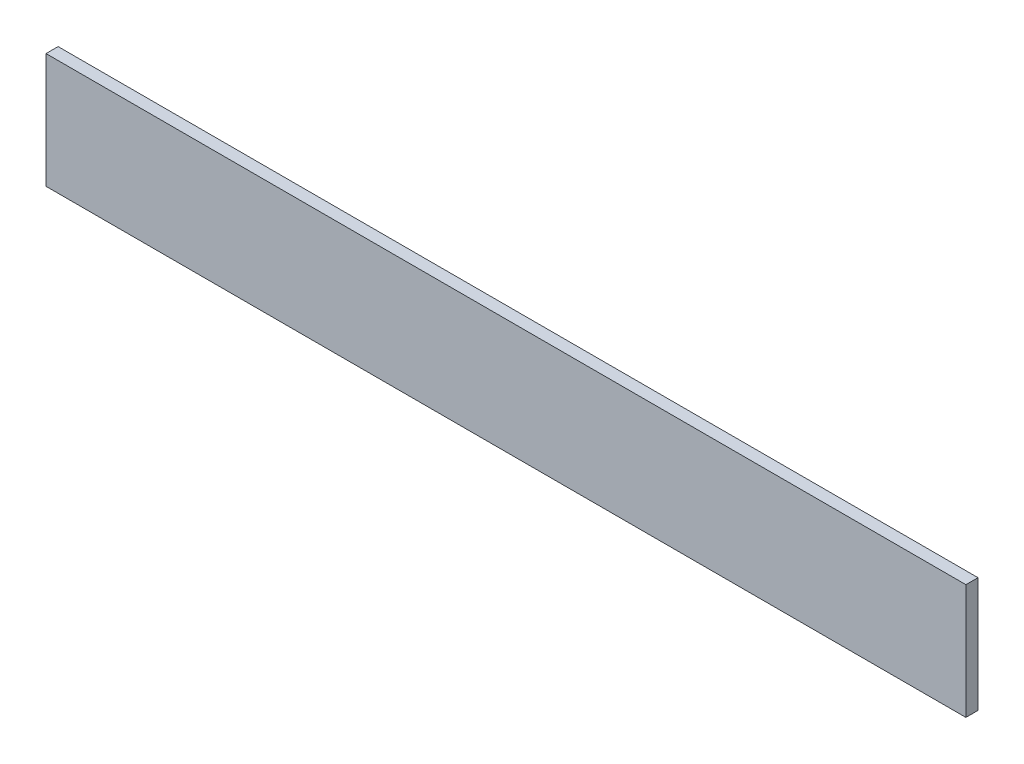
ISO-10303-21;
HEADER;
FILE_DESCRIPTION(('STEP AP214'),'2;1');
FILE_NAME('part.step','',(''),(''),'','','');
FILE_SCHEMA(('AUTOMOTIVE_DESIGN { 1 0 10303 214 1 1 1 1 }'));
ENDSEC;
DATA;
#1=APPLICATION_CONTEXT('core data for automotive mechanical design processes');
#2=APPLICATION_PROTOCOL_DEFINITION('international standard','automotive_design',2000,#1);
#3=PRODUCT_CONTEXT('',#1,'mechanical');
#4=PRODUCT('Part','Part','',(#3));
#5=PRODUCT_RELATED_PRODUCT_CATEGORY('part','',(#4));
#6=PRODUCT_DEFINITION_FORMATION('','',#4);
#7=PRODUCT_DEFINITION_CONTEXT('part definition',#1,'design');
#8=PRODUCT_DEFINITION('design','',#6,#7);
#9=PRODUCT_DEFINITION_SHAPE('','',#8);
#10=(LENGTH_UNIT() NAMED_UNIT(*) SI_UNIT(.MILLI.,.METRE.));
#11=(NAMED_UNIT(*) PLANE_ANGLE_UNIT() SI_UNIT($,.RADIAN.));
#12=(NAMED_UNIT(*) SI_UNIT($,.STERADIAN.) SOLID_ANGLE_UNIT());
#13=UNCERTAINTY_MEASURE_WITH_UNIT(LENGTH_MEASURE(1.E-05),#10,'distance_accuracy_value','');
#14=(GEOMETRIC_REPRESENTATION_CONTEXT(3) GLOBAL_UNCERTAINTY_ASSIGNED_CONTEXT((#13)) GLOBAL_UNIT_ASSIGNED_CONTEXT((#10,
#11,#12)) REPRESENTATION_CONTEXT('',''));
#15=CARTESIAN_POINT('',(0.,0.,0.));
#16=DIRECTION('',(0.,0.,1.));
#17=DIRECTION('',(1.,0.,0.));
#18=AXIS2_PLACEMENT_3D('',#15,#16,#17);
#19=CARTESIAN_POINT('',(-142.666822532732,70.5536912751678,5.));
#20=DIRECTION('',(1.,0.,0.));
#21=DIRECTION('',(0.,1.,0.));
#22=AXIS2_PLACEMENT_3D('',#19,#20,#21);
#23=PLANE('',#22);
#24=DIRECTION('',(0.,-1.,0.));
#25=VECTOR('',#24,1.);
#26=CARTESIAN_POINT('',(-142.666822532732,70.5536912751678,0.));
#27=LINE('',#26,#25);
#28=CARTESIAN_POINT('',(-142.666822532732,70.5536912751678,0.));
#29=VERTEX_POINT('',#28);
#30=CARTESIAN_POINT('',(-142.666822532732,23.0536912751678,0.));
#31=VERTEX_POINT('',#30);
#32=EDGE_CURVE('E96',#29,#31,#27,.T.);
#33=ORIENTED_EDGE('',*,*,#32,.T.);
#34=DIRECTION('',(0.,0.,-1.));
#35=VECTOR('',#34,1.);
#36=CARTESIAN_POINT('',(-142.666822532732,23.0536912751678,5.));
#37=LINE('',#36,#35);
#38=CARTESIAN_POINT('',(-142.666822532732,23.0536912751678,5.));
#39=VERTEX_POINT('',#38);
#40=EDGE_CURVE('E11',#39,#31,#37,.T.);
#41=ORIENTED_EDGE('',*,*,#40,.F.);
#42=DIRECTION('',(0.,-1.,0.));
#43=VECTOR('',#42,1.);
#44=CARTESIAN_POINT('',(-142.666822532732,70.5536912751678,5.));
#45=LINE('',#44,#43);
#46=CARTESIAN_POINT('',(-142.666822532732,70.5536912751678,5.));
#47=VERTEX_POINT('',#46);
#48=EDGE_CURVE('E84',#47,#39,#45,.T.);
#49=ORIENTED_EDGE('',*,*,#48,.F.);
#50=DIRECTION('',(0.,0.,-1.));
#51=VECTOR('',#50,1.);
#52=CARTESIAN_POINT('',(-142.666822532732,70.5536912751678,5.));
#53=LINE('',#52,#51);
#54=EDGE_CURVE('E92',#47,#29,#53,.T.);
#55=ORIENTED_EDGE('',*,*,#54,.T.);
#56=EDGE_LOOP('',(#33,#41,#49,#55));
#57=FACE_BOUND('',#56,.T.);
#58=ADVANCED_FACE('F33',(#57),#23,.F.);
#59=CARTESIAN_POINT('',(-142.666822532732,23.0536912751678,5.));
#60=DIRECTION('',(0.,1.,0.));
#61=DIRECTION('',(0.,0.,1.));
#62=AXIS2_PLACEMENT_3D('',#59,#60,#61);
#63=PLANE('',#62);
#64=DIRECTION('',(1.,0.,0.));
#65=VECTOR('',#64,1.);
#66=CARTESIAN_POINT('',(-142.666822532732,23.0536912751678,0.));
#67=LINE('',#66,#65);
#68=CARTESIAN_POINT('',(237.333177467268,23.0536912751678,0.));
#69=VERTEX_POINT('',#68);
#70=EDGE_CURVE('E88',#31,#69,#67,.T.);
#71=ORIENTED_EDGE('',*,*,#70,.T.);
#72=DIRECTION('',(0.,0.,-1.));
#73=VECTOR('',#72,1.);
#74=CARTESIAN_POINT('',(237.333177467268,23.0536912751678,5.));
#75=LINE('',#74,#73);
#76=CARTESIAN_POINT('',(237.333177467268,23.0536912751678,5.));
#77=VERTEX_POINT('',#76);
#78=EDGE_CURVE('E41',#77,#69,#75,.T.);
#79=ORIENTED_EDGE('',*,*,#78,.F.);
#80=DIRECTION('',(1.,0.,0.));
#81=VECTOR('',#80,1.);
#82=CARTESIAN_POINT('',(-142.666822532732,23.0536912751678,5.));
#83=LINE('',#82,#81);
#84=EDGE_CURVE('E79',#39,#77,#83,.T.);
#85=ORIENTED_EDGE('',*,*,#84,.F.);
#86=ORIENTED_EDGE('',*,*,#40,.T.);
#87=EDGE_LOOP('',(#71,#79,#85,#86));
#88=FACE_BOUND('',#87,.T.);
#89=ADVANCED_FACE('F87',(#88),#63,.F.);
#90=CARTESIAN_POINT('',(237.333177467268,70.5536912751678,5.));
#91=DIRECTION('',(-1.,0.,0.));
#92=DIRECTION('',(0.,-1.,0.));
#93=AXIS2_PLACEMENT_3D('',#90,#91,#92);
#94=PLANE('',#93);
#95=DIRECTION('',(0.,1.,0.));
#96=VECTOR('',#95,1.);
#97=CARTESIAN_POINT('',(237.333177467268,70.5536912751678,0.));
#98=LINE('',#97,#96);
#99=CARTESIAN_POINT('',(237.333177467268,70.5536912751678,0.));
#100=VERTEX_POINT('',#99);
#101=EDGE_CURVE('E66',#69,#100,#98,.T.);
#102=ORIENTED_EDGE('',*,*,#101,.T.);
#103=DIRECTION('',(0.,0.,-1.));
#104=VECTOR('',#103,1.);
#105=CARTESIAN_POINT('',(237.333177467268,70.5536912751678,5.));
#106=LINE('',#105,#104);
#107=CARTESIAN_POINT('',(237.333177467268,70.5536912751678,5.));
#108=VERTEX_POINT('',#107);
#109=EDGE_CURVE('E89',#108,#100,#106,.T.);
#110=ORIENTED_EDGE('',*,*,#109,.F.);
#111=DIRECTION('',(0.,1.,0.));
#112=VECTOR('',#111,1.);
#113=CARTESIAN_POINT('',(237.333177467268,70.5536912751678,5.));
#114=LINE('',#113,#112);
#115=EDGE_CURVE('E82',#77,#108,#114,.T.);
#116=ORIENTED_EDGE('',*,*,#115,.F.);
#117=ORIENTED_EDGE('',*,*,#78,.T.);
#118=EDGE_LOOP('',(#102,#110,#116,#117));
#119=FACE_BOUND('',#118,.T.);
#120=ADVANCED_FACE('F90',(#119),#94,.F.);
#121=CARTESIAN_POINT('',(-142.666822532732,70.5536912751678,5.));
#122=DIRECTION('',(0.,-1.,0.));
#123=DIRECTION('',(0.,0.,-1.));
#124=AXIS2_PLACEMENT_3D('',#121,#122,#123);
#125=PLANE('',#124);
#126=DIRECTION('',(-1.,0.,0.));
#127=VECTOR('',#126,1.);
#128=CARTESIAN_POINT('',(-142.666822532732,70.5536912751678,0.));
#129=LINE('',#128,#127);
#130=EDGE_CURVE('E72',#100,#29,#129,.T.);
#131=ORIENTED_EDGE('',*,*,#130,.T.);
#132=ORIENTED_EDGE('',*,*,#54,.F.);
#133=DIRECTION('',(-1.,0.,0.));
#134=VECTOR('',#133,1.);
#135=CARTESIAN_POINT('',(-142.666822532732,70.5536912751678,5.));
#136=LINE('',#135,#134);
#137=EDGE_CURVE('E49',#108,#47,#136,.T.);
#138=ORIENTED_EDGE('',*,*,#137,.F.);
#139=ORIENTED_EDGE('',*,*,#109,.T.);
#140=EDGE_LOOP('',(#131,#132,#138,#139));
#141=FACE_BOUND('',#140,.T.);
#142=ADVANCED_FACE('F103',(#141),#125,.F.);
#143=CARTESIAN_POINT('',(0.,0.,5.));
#144=DIRECTION('',(0.,0.,1.));
#145=DIRECTION('',(1.,0.,0.));
#146=AXIS2_PLACEMENT_3D('',#143,#144,#145);
#147=PLANE('',#146);
#148=ORIENTED_EDGE('',*,*,#48,.T.);
#149=ORIENTED_EDGE('',*,*,#84,.T.);
#150=ORIENTED_EDGE('',*,*,#115,.T.);
#151=ORIENTED_EDGE('',*,*,#137,.T.);
#152=EDGE_LOOP('',(#148,#149,#150,#151));
#153=FACE_BOUND('',#152,.T.);
#154=ADVANCED_FACE('F80',(#153),#147,.T.);
#155=CARTESIAN_POINT('',(0.,0.,0.));
#156=DIRECTION('',(0.,0.,1.));
#157=DIRECTION('',(1.,0.,0.));
#158=AXIS2_PLACEMENT_3D('',#155,#156,#157);
#159=PLANE('',#158);
#160=ORIENTED_EDGE('',*,*,#32,.F.);
#161=ORIENTED_EDGE('',*,*,#130,.F.);
#162=ORIENTED_EDGE('',*,*,#101,.F.);
#163=ORIENTED_EDGE('',*,*,#70,.F.);
#164=EDGE_LOOP('',(#160,#161,#162,#163));
#165=FACE_BOUND('',#164,.T.);
#166=ADVANCED_FACE('F106',(#165),#159,.F.);
#167=CLOSED_SHELL('',(#58,#89,#120,#142,#154,#166));
#168=MANIFOLD_SOLID_BREP('B2',#167);
#169=ADVANCED_BREP_SHAPE_REPRESENTATION('',(#18,#168),#14);
#170=SHAPE_DEFINITION_REPRESENTATION(#9,#169);
ENDSEC;
END-ISO-10303-21;
